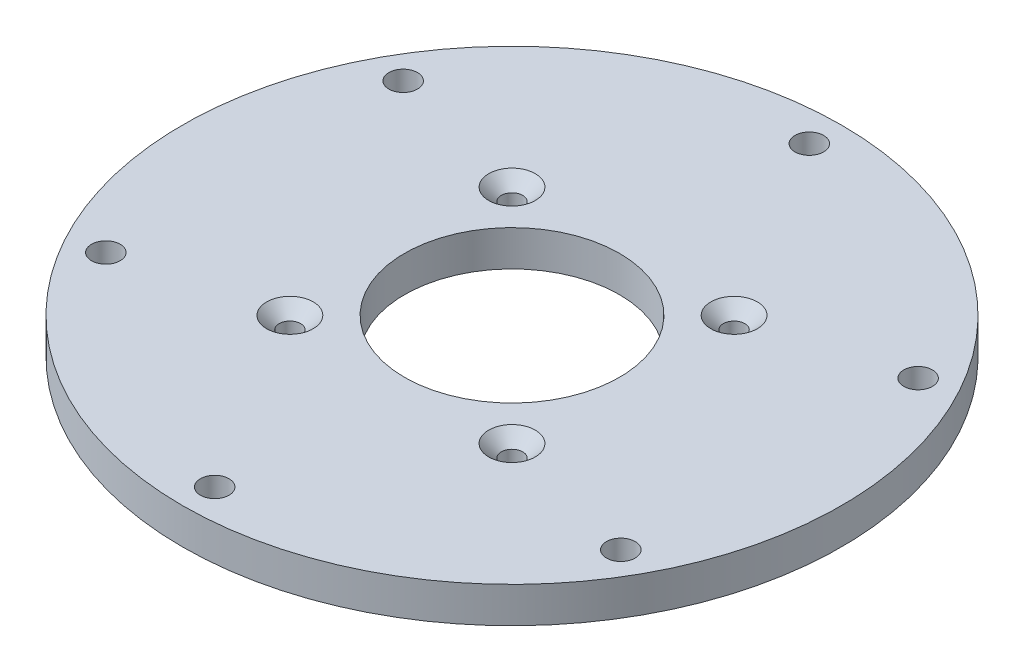
ISO-10303-21;
HEADER;
FILE_DESCRIPTION(('STEP AP214'),'2;1');
FILE_NAME('part.step','',(''),(''),'','','');
FILE_SCHEMA(('AUTOMOTIVE_DESIGN { 1 0 10303 214 1 1 1 1 }'));
ENDSEC;
DATA;
#1=APPLICATION_CONTEXT('core data for automotive mechanical design processes');
#2=APPLICATION_PROTOCOL_DEFINITION('international standard','automotive_design',2000,#1);
#3=PRODUCT_CONTEXT('',#1,'mechanical');
#4=PRODUCT('Part','Part','',(#3));
#5=PRODUCT_RELATED_PRODUCT_CATEGORY('part','',(#4));
#6=PRODUCT_DEFINITION_FORMATION('','',#4);
#7=PRODUCT_DEFINITION_CONTEXT('part definition',#1,'design');
#8=PRODUCT_DEFINITION('design','',#6,#7);
#9=PRODUCT_DEFINITION_SHAPE('','',#8);
#10=(LENGTH_UNIT() NAMED_UNIT(*) SI_UNIT(.MILLI.,.METRE.));
#11=(NAMED_UNIT(*) PLANE_ANGLE_UNIT() SI_UNIT($,.RADIAN.));
#12=(NAMED_UNIT(*) SI_UNIT($,.STERADIAN.) SOLID_ANGLE_UNIT());
#13=UNCERTAINTY_MEASURE_WITH_UNIT(LENGTH_MEASURE(1.E-05),#10,'distance_accuracy_value','');
#14=(GEOMETRIC_REPRESENTATION_CONTEXT(3) GLOBAL_UNCERTAINTY_ASSIGNED_CONTEXT((#13)) GLOBAL_UNIT_ASSIGNED_CONTEXT((#10,
#11,#12)) REPRESENTATION_CONTEXT('',''));
#15=CARTESIAN_POINT('',(0.,0.,0.));
#16=DIRECTION('',(0.,0.,1.));
#17=DIRECTION('',(1.,0.,0.));
#18=AXIS2_PLACEMENT_3D('',#15,#16,#17);
#19=CARTESIAN_POINT('',(-15.5,5.,-15.5));
#20=DIRECTION('',(0.,-1.,0.));
#21=DIRECTION('',(0.,0.,-1.));
#22=AXIS2_PLACEMENT_3D('',#19,#20,#21);
#23=CYLINDRICAL_SURFACE('',#22,1.5);
#24=CARTESIAN_POINT('',(-15.5,3.25,-15.5));
#25=DIRECTION('',(0.,1.,0.));
#26=DIRECTION('',(0.,0.,1.));
#27=AXIS2_PLACEMENT_3D('',#24,#25,#26);
#28=CIRCLE('',#27,1.5);
#29=CARTESIAN_POINT('',(-15.5,3.25,-14.));
#30=VERTEX_POINT('',#29);
#31=EDGE_CURVE('E76',#30,#30,#28,.F.);
#32=ORIENTED_EDGE('',*,*,#31,.F.);
#33=EDGE_LOOP('',(#32));
#34=FACE_BOUND('',#33,.T.);
#35=CARTESIAN_POINT('',(-15.5,0.,-15.5));
#36=DIRECTION('',(0.,1.,0.));
#37=DIRECTION('',(0.,0.,1.));
#38=AXIS2_PLACEMENT_3D('',#35,#36,#37);
#39=CIRCLE('',#38,1.5);
#40=CARTESIAN_POINT('',(-15.5,0.,-14.));
#41=VERTEX_POINT('',#40);
#42=EDGE_CURVE('E55',#41,#41,#39,.T.);
#43=ORIENTED_EDGE('',*,*,#42,.F.);
#44=EDGE_LOOP('',(#43));
#45=FACE_BOUND('',#44,.T.);
#46=ADVANCED_FACE('F39',(#34,#45),#23,.F.);
#47=CARTESIAN_POINT('',(15.5,5.,-15.5));
#48=DIRECTION('',(0.,-1.,0.));
#49=DIRECTION('',(0.,0.,-1.));
#50=AXIS2_PLACEMENT_3D('',#47,#48,#49);
#51=CYLINDRICAL_SURFACE('',#50,1.5);
#52=CARTESIAN_POINT('',(15.5,3.25,-15.5));
#53=DIRECTION('',(0.,1.,0.));
#54=DIRECTION('',(0.,0.,1.));
#55=AXIS2_PLACEMENT_3D('',#52,#53,#54);
#56=CIRCLE('',#55,1.5);
#57=CARTESIAN_POINT('',(15.5,3.25,-14.));
#58=VERTEX_POINT('',#57);
#59=EDGE_CURVE('E215',#58,#58,#56,.F.);
#60=ORIENTED_EDGE('',*,*,#59,.F.);
#61=EDGE_LOOP('',(#60));
#62=FACE_BOUND('',#61,.T.);
#63=CARTESIAN_POINT('',(15.5,0.,-15.5));
#64=DIRECTION('',(0.,1.,0.));
#65=DIRECTION('',(0.,0.,1.));
#66=AXIS2_PLACEMENT_3D('',#63,#64,#65);
#67=CIRCLE('',#66,1.5);
#68=CARTESIAN_POINT('',(15.5,0.,-14.));
#69=VERTEX_POINT('',#68);
#70=EDGE_CURVE('E70',#69,#69,#67,.T.);
#71=ORIENTED_EDGE('',*,*,#70,.F.);
#72=EDGE_LOOP('',(#71));
#73=FACE_BOUND('',#72,.T.);
#74=ADVANCED_FACE('F192',(#62,#73),#51,.F.);
#75=CARTESIAN_POINT('',(15.5,5.,15.5));
#76=DIRECTION('',(0.,-1.,0.));
#77=DIRECTION('',(0.,0.,-1.));
#78=AXIS2_PLACEMENT_3D('',#75,#76,#77);
#79=CYLINDRICAL_SURFACE('',#78,1.5);
#80=CARTESIAN_POINT('',(15.5,3.25,15.5));
#81=DIRECTION('',(0.,1.,0.));
#82=DIRECTION('',(0.,0.,1.));
#83=AXIS2_PLACEMENT_3D('',#80,#81,#82);
#84=CIRCLE('',#83,1.5);
#85=CARTESIAN_POINT('',(15.5,3.25,17.));
#86=VERTEX_POINT('',#85);
#87=EDGE_CURVE('E43',#86,#86,#84,.F.);
#88=ORIENTED_EDGE('',*,*,#87,.F.);
#89=EDGE_LOOP('',(#88));
#90=FACE_BOUND('',#89,.T.);
#91=CARTESIAN_POINT('',(15.5,0.,15.5));
#92=DIRECTION('',(0.,1.,0.));
#93=DIRECTION('',(0.,0.,1.));
#94=AXIS2_PLACEMENT_3D('',#91,#92,#93);
#95=CIRCLE('',#94,1.5);
#96=CARTESIAN_POINT('',(15.5,0.,17.));
#97=VERTEX_POINT('',#96);
#98=EDGE_CURVE('E65',#97,#97,#95,.T.);
#99=ORIENTED_EDGE('',*,*,#98,.F.);
#100=EDGE_LOOP('',(#99));
#101=FACE_BOUND('',#100,.T.);
#102=ADVANCED_FACE('F188',(#90,#101),#79,.F.);
#103=CARTESIAN_POINT('',(-15.5,5.,15.5));
#104=DIRECTION('',(0.,-1.,0.));
#105=DIRECTION('',(0.,0.,-1.));
#106=AXIS2_PLACEMENT_3D('',#103,#104,#105);
#107=CYLINDRICAL_SURFACE('',#106,1.5);
#108=CARTESIAN_POINT('',(-15.5,3.25,15.5));
#109=DIRECTION('',(0.,1.,0.));
#110=DIRECTION('',(0.,0.,1.));
#111=AXIS2_PLACEMENT_3D('',#108,#109,#110);
#112=CIRCLE('',#111,1.5);
#113=CARTESIAN_POINT('',(-15.5,3.25,17.));
#114=VERTEX_POINT('',#113);
#115=EDGE_CURVE('E90',#114,#114,#112,.F.);
#116=ORIENTED_EDGE('',*,*,#115,.F.);
#117=EDGE_LOOP('',(#116));
#118=FACE_BOUND('',#117,.T.);
#119=CARTESIAN_POINT('',(-15.5,0.,15.5));
#120=DIRECTION('',(0.,1.,0.));
#121=DIRECTION('',(0.,0.,1.));
#122=AXIS2_PLACEMENT_3D('',#119,#120,#121);
#123=CIRCLE('',#122,1.5);
#124=CARTESIAN_POINT('',(-15.5,0.,17.));
#125=VERTEX_POINT('',#124);
#126=EDGE_CURVE('E61',#125,#125,#123,.T.);
#127=ORIENTED_EDGE('',*,*,#126,.F.);
#128=EDGE_LOOP('',(#127));
#129=FACE_BOUND('',#128,.T.);
#130=ADVANCED_FACE('F41',(#118,#129),#107,.F.);
#131=CARTESIAN_POINT('',(0.,5.,0.));
#132=DIRECTION('',(0.,-1.,0.));
#133=DIRECTION('',(0.,0.,-1.));
#134=AXIS2_PLACEMENT_3D('',#131,#132,#133);
#135=CYLINDRICAL_SURFACE('',#134,46.);
#136=CARTESIAN_POINT('',(0.,5.,0.));
#137=DIRECTION('',(0.,1.,0.));
#138=DIRECTION('',(0.,0.,1.));
#139=AXIS2_PLACEMENT_3D('',#136,#137,#138);
#140=CIRCLE('',#139,46.);
#141=CARTESIAN_POINT('',(0.,5.,46.));
#142=VERTEX_POINT('',#141);
#143=EDGE_CURVE('E10',#142,#142,#140,.T.);
#144=ORIENTED_EDGE('',*,*,#143,.F.);
#145=EDGE_LOOP('',(#144));
#146=FACE_BOUND('',#145,.T.);
#147=CARTESIAN_POINT('',(0.,0.,0.));
#148=DIRECTION('',(0.,1.,0.));
#149=DIRECTION('',(0.,0.,1.));
#150=AXIS2_PLACEMENT_3D('',#147,#148,#149);
#151=CIRCLE('',#150,46.);
#152=CARTESIAN_POINT('',(0.,0.,46.));
#153=VERTEX_POINT('',#152);
#154=EDGE_CURVE('E48',#153,#153,#151,.T.);
#155=ORIENTED_EDGE('',*,*,#154,.T.);
#156=EDGE_LOOP('',(#155));
#157=FACE_BOUND('',#156,.T.);
#158=ADVANCED_FACE('F178',(#146,#157),#135,.T.);
#159=CARTESIAN_POINT('',(0.,5.,0.));
#160=DIRECTION('',(0.,1.,0.));
#161=DIRECTION('',(0.,0.,1.));
#162=AXIS2_PLACEMENT_3D('',#159,#160,#161);
#163=PLANE('',#162);
#164=CARTESIAN_POINT('',(15.5,5.,-15.5));
#165=DIRECTION('',(0.,1.,0.));
#166=DIRECTION('',(0.,0.,1.));
#167=AXIS2_PLACEMENT_3D('',#164,#165,#166);
#168=CIRCLE('',#167,3.25);
#169=CARTESIAN_POINT('',(15.5,5.,-12.25));
#170=VERTEX_POINT('',#169);
#171=EDGE_CURVE('E222',#170,#170,#168,.T.);
#172=ORIENTED_EDGE('',*,*,#171,.F.);
#173=EDGE_LOOP('',(#172));
#174=FACE_BOUND('',#173,.T.);
#175=CARTESIAN_POINT('',(15.5,5.,15.5));
#176=DIRECTION('',(0.,1.,0.));
#177=DIRECTION('',(0.,0.,1.));
#178=AXIS2_PLACEMENT_3D('',#175,#176,#177);
#179=CIRCLE('',#178,3.25);
#180=CARTESIAN_POINT('',(15.5,5.,18.75));
#181=VERTEX_POINT('',#180);
#182=EDGE_CURVE('E209',#181,#181,#179,.T.);
#183=ORIENTED_EDGE('',*,*,#182,.F.);
#184=EDGE_LOOP('',(#183));
#185=FACE_BOUND('',#184,.T.);
#186=CARTESIAN_POINT('',(-15.5,5.,15.5));
#187=DIRECTION('',(0.,1.,0.));
#188=DIRECTION('',(0.,0.,1.));
#189=AXIS2_PLACEMENT_3D('',#186,#187,#188);
#190=CIRCLE('',#189,3.25);
#191=CARTESIAN_POINT('',(-15.5,5.,18.75));
#192=VERTEX_POINT('',#191);
#193=EDGE_CURVE('E97',#192,#192,#190,.T.);
#194=ORIENTED_EDGE('',*,*,#193,.F.);
#195=EDGE_LOOP('',(#194));
#196=FACE_BOUND('',#195,.T.);
#197=CARTESIAN_POINT('',(-15.5,5.,-15.5));
#198=DIRECTION('',(0.,1.,0.));
#199=DIRECTION('',(0.,0.,1.));
#200=AXIS2_PLACEMENT_3D('',#197,#198,#199);
#201=CIRCLE('',#200,3.25);
#202=CARTESIAN_POINT('',(-15.5,5.,-12.25));
#203=VERTEX_POINT('',#202);
#204=EDGE_CURVE('E80',#203,#203,#201,.T.);
#205=ORIENTED_EDGE('',*,*,#204,.F.);
#206=EDGE_LOOP('',(#205));
#207=FACE_BOUND('',#206,.T.);
#208=CARTESIAN_POINT('',(0.,5.,0.));
#209=DIRECTION('',(0.,-1.,0.));
#210=DIRECTION('',(0.,0.,-1.));
#211=AXIS2_PLACEMENT_3D('',#208,#209,#210);
#212=CIRCLE('',#211,15.);
#213=CARTESIAN_POINT('',(0.,5.,-15.));
#214=VERTEX_POINT('',#213);
#215=EDGE_CURVE('E87',#214,#214,#212,.T.);
#216=ORIENTED_EDGE('',*,*,#215,.T.);
#217=EDGE_LOOP('',(#216));
#218=FACE_BOUND('',#217,.T.);
#219=CARTESIAN_POINT('',(0.,5.,41.5));
#220=DIRECTION('',(0.,-1.,0.));
#221=DIRECTION('',(0.,0.,-1.));
#222=AXIS2_PLACEMENT_3D('',#219,#220,#221);
#223=CIRCLE('',#222,2.);
#224=CARTESIAN_POINT('',(0.,5.,39.5));
#225=VERTEX_POINT('',#224);
#226=EDGE_CURVE('E66',#225,#225,#223,.T.);
#227=ORIENTED_EDGE('',*,*,#226,.T.);
#228=EDGE_LOOP('',(#227));
#229=FACE_BOUND('',#228,.T.);
#230=CARTESIAN_POINT('',(-35.9400542570542,5.,20.75));
#231=DIRECTION('',(0.,-1.,0.));
#232=DIRECTION('',(0.,0.,-1.));
#233=AXIS2_PLACEMENT_3D('',#230,#231,#232);
#234=CIRCLE('',#233,2.);
#235=CARTESIAN_POINT('',(-35.9400542570542,5.,18.75));
#236=VERTEX_POINT('',#235);
#237=EDGE_CURVE('E113',#236,#236,#234,.T.);
#238=ORIENTED_EDGE('',*,*,#237,.T.);
#239=EDGE_LOOP('',(#238));
#240=FACE_BOUND('',#239,.T.);
#241=CARTESIAN_POINT('',(-35.9400542570542,5.,-20.75));
#242=DIRECTION('',(0.,-1.,0.));
#243=DIRECTION('',(0.,0.,-1.));
#244=AXIS2_PLACEMENT_3D('',#241,#242,#243);
#245=CIRCLE('',#244,2.);
#246=CARTESIAN_POINT('',(-35.9400542570542,5.,-22.75));
#247=VERTEX_POINT('',#246);
#248=EDGE_CURVE('E142',#247,#247,#245,.T.);
#249=ORIENTED_EDGE('',*,*,#248,.T.);
#250=EDGE_LOOP('',(#249));
#251=FACE_BOUND('',#250,.T.);
#252=CARTESIAN_POINT('',(0.,5.,-41.5));
#253=DIRECTION('',(0.,-1.,0.));
#254=DIRECTION('',(0.,0.,-1.));
#255=AXIS2_PLACEMENT_3D('',#252,#253,#254);
#256=CIRCLE('',#255,2.);
#257=CARTESIAN_POINT('',(0.,5.,-43.5));
#258=VERTEX_POINT('',#257);
#259=EDGE_CURVE('E135',#258,#258,#256,.T.);
#260=ORIENTED_EDGE('',*,*,#259,.T.);
#261=EDGE_LOOP('',(#260));
#262=FACE_BOUND('',#261,.T.);
#263=CARTESIAN_POINT('',(35.9400542570542,5.,-20.75));
#264=DIRECTION('',(0.,-1.,0.));
#265=DIRECTION('',(0.,0.,-1.));
#266=AXIS2_PLACEMENT_3D('',#263,#264,#265);
#267=CIRCLE('',#266,2.);
#268=CARTESIAN_POINT('',(35.9400542570542,5.,-22.75));
#269=VERTEX_POINT('',#268);
#270=EDGE_CURVE('E127',#269,#269,#267,.T.);
#271=ORIENTED_EDGE('',*,*,#270,.T.);
#272=EDGE_LOOP('',(#271));
#273=FACE_BOUND('',#272,.T.);
#274=CARTESIAN_POINT('',(35.9400542570542,5.,20.75));
#275=DIRECTION('',(0.,-1.,0.));
#276=DIRECTION('',(0.,0.,-1.));
#277=AXIS2_PLACEMENT_3D('',#274,#275,#276);
#278=CIRCLE('',#277,2.00000000000001);
#279=CARTESIAN_POINT('',(35.9400542570542,5.,18.75));
#280=VERTEX_POINT('',#279);
#281=EDGE_CURVE('E112',#280,#280,#278,.T.);
#282=ORIENTED_EDGE('',*,*,#281,.T.);
#283=EDGE_LOOP('',(#282));
#284=FACE_BOUND('',#283,.T.);
#285=ORIENTED_EDGE('',*,*,#143,.T.);
#286=EDGE_LOOP('',(#285));
#287=FACE_BOUND('',#286,.T.);
#288=ADVANCED_FACE('F159',(#174,#185,#196,#207,#218,#229,#240,#251,#262,#273,#284,#287),#163,.T.);
#289=CARTESIAN_POINT('',(0.,0.,0.));
#290=DIRECTION('',(0.,1.,0.));
#291=DIRECTION('',(0.,0.,1.));
#292=AXIS2_PLACEMENT_3D('',#289,#290,#291);
#293=PLANE('',#292);
#294=CARTESIAN_POINT('',(0.,0.,0.));
#295=DIRECTION('',(0.,-1.,0.));
#296=DIRECTION('',(0.,0.,-1.));
#297=AXIS2_PLACEMENT_3D('',#294,#295,#296);
#298=CIRCLE('',#297,15.);
#299=CARTESIAN_POINT('',(0.,0.,-15.));
#300=VERTEX_POINT('',#299);
#301=EDGE_CURVE('E79',#300,#300,#298,.T.);
#302=ORIENTED_EDGE('',*,*,#301,.F.);
#303=EDGE_LOOP('',(#302));
#304=FACE_BOUND('',#303,.T.);
#305=CARTESIAN_POINT('',(0.,0.,41.5));
#306=DIRECTION('',(0.,-1.,0.));
#307=DIRECTION('',(0.,0.,-1.));
#308=AXIS2_PLACEMENT_3D('',#305,#306,#307);
#309=CIRCLE('',#308,2.);
#310=CARTESIAN_POINT('',(0.,0.,39.5));
#311=VERTEX_POINT('',#310);
#312=EDGE_CURVE('E108',#311,#311,#309,.T.);
#313=ORIENTED_EDGE('',*,*,#312,.F.);
#314=EDGE_LOOP('',(#313));
#315=FACE_BOUND('',#314,.T.);
#316=CARTESIAN_POINT('',(-35.9400542570542,0.,20.75));
#317=DIRECTION('',(0.,-1.,0.));
#318=DIRECTION('',(0.,0.,-1.));
#319=AXIS2_PLACEMENT_3D('',#316,#317,#318);
#320=CIRCLE('',#319,2.);
#321=CARTESIAN_POINT('',(-35.9400542570542,0.,18.75));
#322=VERTEX_POINT('',#321);
#323=EDGE_CURVE('E103',#322,#322,#320,.T.);
#324=ORIENTED_EDGE('',*,*,#323,.F.);
#325=EDGE_LOOP('',(#324));
#326=FACE_BOUND('',#325,.T.);
#327=CARTESIAN_POINT('',(-35.9400542570542,0.,-20.75));
#328=DIRECTION('',(0.,-1.,0.));
#329=DIRECTION('',(0.,0.,-1.));
#330=AXIS2_PLACEMENT_3D('',#327,#328,#329);
#331=CIRCLE('',#330,2.);
#332=CARTESIAN_POINT('',(-35.9400542570542,0.,-22.75));
#333=VERTEX_POINT('',#332);
#334=EDGE_CURVE('E59',#333,#333,#331,.T.);
#335=ORIENTED_EDGE('',*,*,#334,.F.);
#336=EDGE_LOOP('',(#335));
#337=FACE_BOUND('',#336,.T.);
#338=CARTESIAN_POINT('',(0.,0.,-41.5));
#339=DIRECTION('',(0.,-1.,0.));
#340=DIRECTION('',(0.,0.,-1.));
#341=AXIS2_PLACEMENT_3D('',#338,#339,#340);
#342=CIRCLE('',#341,2.);
#343=CARTESIAN_POINT('',(0.,0.,-43.5));
#344=VERTEX_POINT('',#343);
#345=EDGE_CURVE('E139',#344,#344,#342,.T.);
#346=ORIENTED_EDGE('',*,*,#345,.F.);
#347=EDGE_LOOP('',(#346));
#348=FACE_BOUND('',#347,.T.);
#349=CARTESIAN_POINT('',(35.9400542570542,0.,-20.75));
#350=DIRECTION('',(0.,-1.,0.));
#351=DIRECTION('',(0.,0.,-1.));
#352=AXIS2_PLACEMENT_3D('',#349,#350,#351);
#353=CIRCLE('',#352,2.);
#354=CARTESIAN_POINT('',(35.9400542570542,0.,-22.75));
#355=VERTEX_POINT('',#354);
#356=EDGE_CURVE('E131',#355,#355,#353,.T.);
#357=ORIENTED_EDGE('',*,*,#356,.F.);
#358=EDGE_LOOP('',(#357));
#359=FACE_BOUND('',#358,.T.);
#360=CARTESIAN_POINT('',(35.9400542570542,0.,20.75));
#361=DIRECTION('',(0.,-1.,0.));
#362=DIRECTION('',(0.,0.,-1.));
#363=AXIS2_PLACEMENT_3D('',#360,#361,#362);
#364=CIRCLE('',#363,2.00000000000001);
#365=CARTESIAN_POINT('',(35.9400542570542,0.,18.75));
#366=VERTEX_POINT('',#365);
#367=EDGE_CURVE('E123',#366,#366,#364,.T.);
#368=ORIENTED_EDGE('',*,*,#367,.F.);
#369=EDGE_LOOP('',(#368));
#370=FACE_BOUND('',#369,.T.);
#371=ORIENTED_EDGE('',*,*,#126,.T.);
#372=EDGE_LOOP('',(#371));
#373=FACE_BOUND('',#372,.T.);
#374=ORIENTED_EDGE('',*,*,#98,.T.);
#375=EDGE_LOOP('',(#374));
#376=FACE_BOUND('',#375,.T.);
#377=ORIENTED_EDGE('',*,*,#70,.T.);
#378=EDGE_LOOP('',(#377));
#379=FACE_BOUND('',#378,.T.);
#380=ORIENTED_EDGE('',*,*,#42,.T.);
#381=EDGE_LOOP('',(#380));
#382=FACE_BOUND('',#381,.T.);
#383=ORIENTED_EDGE('',*,*,#154,.F.);
#384=EDGE_LOOP('',(#383));
#385=FACE_BOUND('',#384,.T.);
#386=ADVANCED_FACE('F155',(#304,#315,#326,#337,#348,#359,#370,#373,#376,#379,#382,#385),#293,.F.);
#387=CARTESIAN_POINT('',(35.9400542570542,5.,20.75));
#388=DIRECTION('',(0.,-1.,0.));
#389=DIRECTION('',(0.,0.,-1.));
#390=AXIS2_PLACEMENT_3D('',#387,#388,#389);
#391=CYLINDRICAL_SURFACE('',#390,2.00000000000001);
#392=ORIENTED_EDGE('',*,*,#281,.F.);
#393=EDGE_LOOP('',(#392));
#394=FACE_BOUND('',#393,.T.);
#395=ORIENTED_EDGE('',*,*,#367,.T.);
#396=EDGE_LOOP('',(#395));
#397=FACE_BOUND('',#396,.T.);
#398=ADVANCED_FACE('F158',(#394,#397),#391,.F.);
#399=CARTESIAN_POINT('',(35.9400542570542,5.,-20.75));
#400=DIRECTION('',(0.,-1.,0.));
#401=DIRECTION('',(0.,0.,-1.));
#402=AXIS2_PLACEMENT_3D('',#399,#400,#401);
#403=CYLINDRICAL_SURFACE('',#402,2.);
#404=ORIENTED_EDGE('',*,*,#270,.F.);
#405=EDGE_LOOP('',(#404));
#406=FACE_BOUND('',#405,.T.);
#407=ORIENTED_EDGE('',*,*,#356,.T.);
#408=EDGE_LOOP('',(#407));
#409=FACE_BOUND('',#408,.T.);
#410=ADVANCED_FACE('F250',(#406,#409),#403,.F.);
#411=CARTESIAN_POINT('',(0.,5.,-41.5));
#412=DIRECTION('',(0.,-1.,0.));
#413=DIRECTION('',(0.,0.,-1.));
#414=AXIS2_PLACEMENT_3D('',#411,#412,#413);
#415=CYLINDRICAL_SURFACE('',#414,2.);
#416=ORIENTED_EDGE('',*,*,#259,.F.);
#417=EDGE_LOOP('',(#416));
#418=FACE_BOUND('',#417,.T.);
#419=ORIENTED_EDGE('',*,*,#345,.T.);
#420=EDGE_LOOP('',(#419));
#421=FACE_BOUND('',#420,.T.);
#422=ADVANCED_FACE('F255',(#418,#421),#415,.F.);
#423=CARTESIAN_POINT('',(-35.9400542570542,5.,-20.75));
#424=DIRECTION('',(0.,-1.,0.));
#425=DIRECTION('',(0.,0.,-1.));
#426=AXIS2_PLACEMENT_3D('',#423,#424,#425);
#427=CYLINDRICAL_SURFACE('',#426,2.);
#428=ORIENTED_EDGE('',*,*,#248,.F.);
#429=EDGE_LOOP('',(#428));
#430=FACE_BOUND('',#429,.T.);
#431=ORIENTED_EDGE('',*,*,#334,.T.);
#432=EDGE_LOOP('',(#431));
#433=FACE_BOUND('',#432,.T.);
#434=ADVANCED_FACE('F153',(#430,#433),#427,.F.);
#435=CARTESIAN_POINT('',(-35.9400542570542,5.,20.75));
#436=DIRECTION('',(0.,-1.,0.));
#437=DIRECTION('',(0.,0.,-1.));
#438=AXIS2_PLACEMENT_3D('',#435,#436,#437);
#439=CYLINDRICAL_SURFACE('',#438,2.);
#440=ORIENTED_EDGE('',*,*,#237,.F.);
#441=EDGE_LOOP('',(#440));
#442=FACE_BOUND('',#441,.T.);
#443=ORIENTED_EDGE('',*,*,#323,.T.);
#444=EDGE_LOOP('',(#443));
#445=FACE_BOUND('',#444,.T.);
#446=ADVANCED_FACE('F259',(#442,#445),#439,.F.);
#447=CARTESIAN_POINT('',(0.,5.,41.5));
#448=DIRECTION('',(0.,-1.,0.));
#449=DIRECTION('',(0.,0.,-1.));
#450=AXIS2_PLACEMENT_3D('',#447,#448,#449);
#451=CYLINDRICAL_SURFACE('',#450,2.);
#452=ORIENTED_EDGE('',*,*,#226,.F.);
#453=EDGE_LOOP('',(#452));
#454=FACE_BOUND('',#453,.T.);
#455=ORIENTED_EDGE('',*,*,#312,.T.);
#456=EDGE_LOOP('',(#455));
#457=FACE_BOUND('',#456,.T.);
#458=ADVANCED_FACE('F270',(#454,#457),#451,.F.);
#459=CARTESIAN_POINT('',(0.,5.,0.));
#460=DIRECTION('',(0.,-1.,0.));
#461=DIRECTION('',(0.,0.,-1.));
#462=AXIS2_PLACEMENT_3D('',#459,#460,#461);
#463=CYLINDRICAL_SURFACE('',#462,15.);
#464=ORIENTED_EDGE('',*,*,#215,.F.);
#465=EDGE_LOOP('',(#464));
#466=FACE_BOUND('',#465,.T.);
#467=ORIENTED_EDGE('',*,*,#301,.T.);
#468=EDGE_LOOP('',(#467));
#469=FACE_BOUND('',#468,.T.);
#470=ADVANCED_FACE('F275',(#466,#469),#463,.F.);
#471=CARTESIAN_POINT('',(-15.5,5.,-15.5));
#472=DIRECTION('',(0.,1.,0.));
#473=DIRECTION('',(0.,0.,1.));
#474=AXIS2_PLACEMENT_3D('',#471,#472,#473);
#475=CONICAL_SURFACE('',#474,3.25,0.785398163397448);
#476=ORIENTED_EDGE('',*,*,#31,.T.);
#477=EDGE_LOOP('',(#476));
#478=FACE_BOUND('',#477,.T.);
#479=ORIENTED_EDGE('',*,*,#204,.T.);
#480=EDGE_LOOP('',(#479));
#481=FACE_BOUND('',#480,.T.);
#482=ADVANCED_FACE('F283',(#478,#481),#475,.F.);
#483=CARTESIAN_POINT('',(-15.5,5.,15.5));
#484=DIRECTION('',(0.,1.,0.));
#485=DIRECTION('',(0.,0.,1.));
#486=AXIS2_PLACEMENT_3D('',#483,#484,#485);
#487=CONICAL_SURFACE('',#486,3.25,0.785398163397448);
#488=ORIENTED_EDGE('',*,*,#115,.T.);
#489=EDGE_LOOP('',(#488));
#490=FACE_BOUND('',#489,.T.);
#491=ORIENTED_EDGE('',*,*,#193,.T.);
#492=EDGE_LOOP('',(#491));
#493=FACE_BOUND('',#492,.T.);
#494=ADVANCED_FACE('F290',(#490,#493),#487,.F.);
#495=CARTESIAN_POINT('',(15.5,5.,15.5));
#496=DIRECTION('',(0.,1.,0.));
#497=DIRECTION('',(0.,0.,1.));
#498=AXIS2_PLACEMENT_3D('',#495,#496,#497);
#499=CONICAL_SURFACE('',#498,3.25,0.785398163397448);
#500=ORIENTED_EDGE('',*,*,#87,.T.);
#501=EDGE_LOOP('',(#500));
#502=FACE_BOUND('',#501,.T.);
#503=ORIENTED_EDGE('',*,*,#182,.T.);
#504=EDGE_LOOP('',(#503));
#505=FACE_BOUND('',#504,.T.);
#506=ADVANCED_FACE('F293',(#502,#505),#499,.F.);
#507=CARTESIAN_POINT('',(15.5,5.,-15.5));
#508=DIRECTION('',(0.,1.,0.));
#509=DIRECTION('',(0.,0.,1.));
#510=AXIS2_PLACEMENT_3D('',#507,#508,#509);
#511=CONICAL_SURFACE('',#510,3.25,0.785398163397448);
#512=ORIENTED_EDGE('',*,*,#59,.T.);
#513=EDGE_LOOP('',(#512));
#514=FACE_BOUND('',#513,.T.);
#515=ORIENTED_EDGE('',*,*,#171,.T.);
#516=EDGE_LOOP('',(#515));
#517=FACE_BOUND('',#516,.T.);
#518=ADVANCED_FACE('F230',(#514,#517),#511,.F.);
#519=CLOSED_SHELL('',(#46,#74,#102,#130,#158,#288,#386,#398,#410,#422,#434,#446,#458,#470,#482,
#494,#506,#518));
#520=MANIFOLD_SOLID_BREP('B2',#519);
#521=ADVANCED_BREP_SHAPE_REPRESENTATION('',(#18,#520),#14);
#522=SHAPE_DEFINITION_REPRESENTATION(#9,#521);
ENDSEC;
END-ISO-10303-21;
